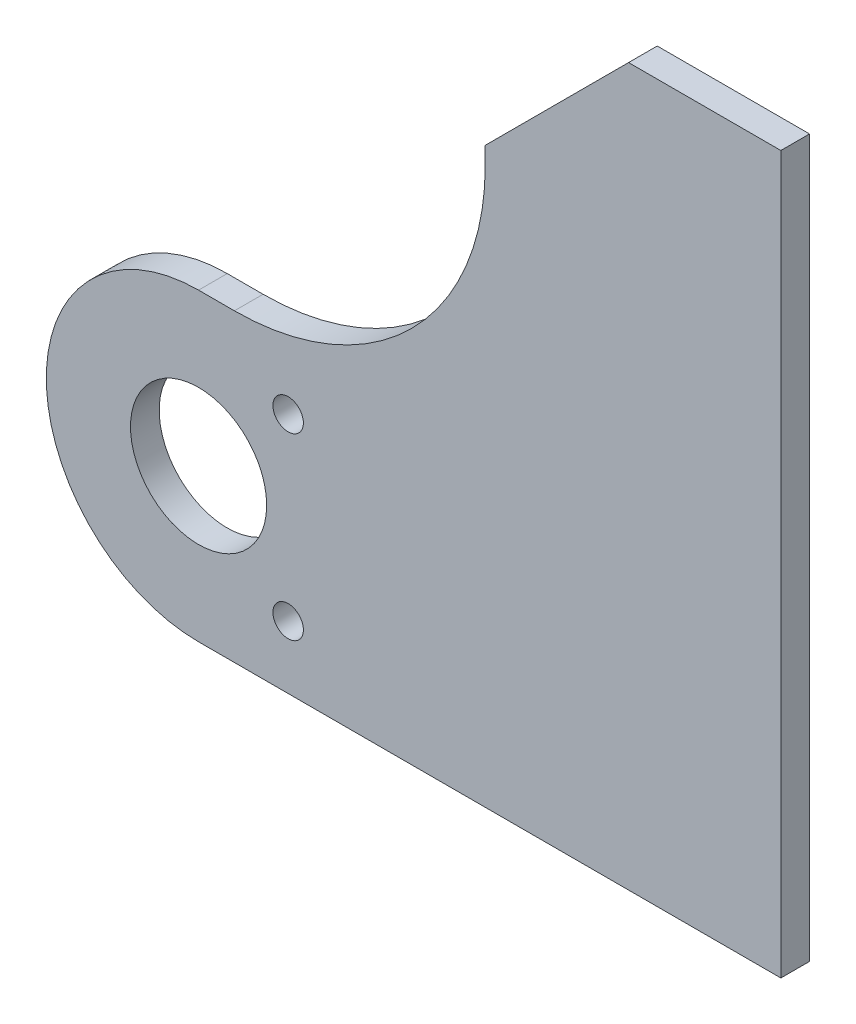
ISO-10303-21;
HEADER;
FILE_DESCRIPTION(('STEP AP214'),'2;1');
FILE_NAME('part.step','',(''),(''),'','','');
FILE_SCHEMA(('AUTOMOTIVE_DESIGN { 1 0 10303 214 1 1 1 1 }'));
ENDSEC;
DATA;
#1=APPLICATION_CONTEXT('core data for automotive mechanical design processes');
#2=APPLICATION_PROTOCOL_DEFINITION('international standard','automotive_design',2000,#1);
#3=PRODUCT_CONTEXT('',#1,'mechanical');
#4=PRODUCT('Part','Part','',(#3));
#5=PRODUCT_RELATED_PRODUCT_CATEGORY('part','',(#4));
#6=PRODUCT_DEFINITION_FORMATION('','',#4);
#7=PRODUCT_DEFINITION_CONTEXT('part definition',#1,'design');
#8=PRODUCT_DEFINITION('design','',#6,#7);
#9=PRODUCT_DEFINITION_SHAPE('','',#8);
#10=(LENGTH_UNIT() NAMED_UNIT(*) SI_UNIT(.MILLI.,.METRE.));
#11=(NAMED_UNIT(*) PLANE_ANGLE_UNIT() SI_UNIT($,.RADIAN.));
#12=(NAMED_UNIT(*) SI_UNIT($,.STERADIAN.) SOLID_ANGLE_UNIT());
#13=UNCERTAINTY_MEASURE_WITH_UNIT(LENGTH_MEASURE(1.E-05),#10,'distance_accuracy_value','');
#14=(GEOMETRIC_REPRESENTATION_CONTEXT(3) GLOBAL_UNCERTAINTY_ASSIGNED_CONTEXT((#13)) GLOBAL_UNIT_ASSIGNED_CONTEXT((#10,
#11,#12)) REPRESENTATION_CONTEXT('',''));
#15=CARTESIAN_POINT('',(0.,0.,0.));
#16=DIRECTION('',(0.,0.,1.));
#17=DIRECTION('',(1.,0.,0.));
#18=AXIS2_PLACEMENT_3D('',#15,#16,#17);
#19=CARTESIAN_POINT('',(0.,0.,4.));
#20=DIRECTION('',(0.,0.,1.));
#21=DIRECTION('',(1.,0.,0.));
#22=AXIS2_PLACEMENT_3D('',#19,#20,#21);
#23=PLANE('',#22);
#24=CARTESIAN_POINT('',(25.,-25.,4.));
#25=DIRECTION('',(0.,0.,1.));
#26=DIRECTION('',(1.,0.,0.));
#27=AXIS2_PLACEMENT_3D('',#24,#25,#26);
#28=CIRCLE('',#27,4.24999999999999);
#29=CARTESIAN_POINT('',(29.25,-25.,4.));
#30=VERTEX_POINT('',#29);
#31=EDGE_CURVE('E242',#30,#30,#28,.T.);
#32=ORIENTED_EDGE('',*,*,#31,.F.);
#33=EDGE_LOOP('',(#32));
#34=FACE_BOUND('',#33,.T.);
#35=CARTESIAN_POINT('',(25.,25.,4.));
#36=DIRECTION('',(0.,0.,1.));
#37=DIRECTION('',(1.,0.,0.));
#38=AXIS2_PLACEMENT_3D('',#35,#36,#37);
#39=CIRCLE('',#38,4.24999999999999);
#40=CARTESIAN_POINT('',(29.25,25.,4.));
#41=VERTEX_POINT('',#40);
#42=EDGE_CURVE('E234',#41,#41,#39,.T.);
#43=ORIENTED_EDGE('',*,*,#42,.F.);
#44=EDGE_LOOP('',(#43));
#45=FACE_BOUND('',#44,.T.);
#46=DIRECTION('',(-0.707106781186547,-0.707106781186548,0.));
#47=VECTOR('',#46,1.);
#48=CARTESIAN_POINT('',(80.,117.5,4.));
#49=LINE('',#48,#47);
#50=CARTESIAN_POINT('',(120.,157.5,4.));
#51=VERTEX_POINT('',#50);
#52=CARTESIAN_POINT('',(80.,117.5,4.));
#53=VERTEX_POINT('',#52);
#54=EDGE_CURVE('E178',#51,#53,#49,.T.);
#55=ORIENTED_EDGE('',*,*,#54,.T.);
#56=DIRECTION('',(0.,-1.,0.));
#57=VECTOR('',#56,1.);
#58=CARTESIAN_POINT('',(80.,112.5,4.));
#59=LINE('',#58,#57);
#60=CARTESIAN_POINT('',(80.,112.5,4.));
#61=VERTEX_POINT('',#60);
#62=EDGE_CURVE('E114',#53,#61,#59,.T.);
#63=ORIENTED_EDGE('',*,*,#62,.T.);
#64=CARTESIAN_POINT('',(10.,112.5,4.));
#65=DIRECTION('',(0.,0.,-1.));
#66=DIRECTION('',(-1.,0.,0.));
#67=AXIS2_PLACEMENT_3D('',#64,#65,#66);
#68=CIRCLE('',#67,70.);
#69=CARTESIAN_POINT('',(10.,42.5,4.));
#70=VERTEX_POINT('',#69);
#71=EDGE_CURVE('E199',#61,#70,#68,.T.);
#72=ORIENTED_EDGE('',*,*,#71,.T.);
#73=DIRECTION('',(-1.,0.,0.));
#74=VECTOR('',#73,1.);
#75=CARTESIAN_POINT('',(0.,42.5,4.));
#76=LINE('',#75,#74);
#77=CARTESIAN_POINT('',(0.,42.5,4.));
#78=VERTEX_POINT('',#77);
#79=EDGE_CURVE('E213',#70,#78,#76,.T.);
#80=ORIENTED_EDGE('',*,*,#79,.T.);
#81=CARTESIAN_POINT('',(0.,0.,4.));
#82=DIRECTION('',(0.,0.,1.));
#83=DIRECTION('',(1.,0.,0.));
#84=AXIS2_PLACEMENT_3D('',#81,#82,#83);
#85=CIRCLE('',#84,42.5);
#86=CARTESIAN_POINT('',(0.,-42.5,4.));
#87=VERTEX_POINT('',#86);
#88=EDGE_CURVE('E133',#78,#87,#85,.T.);
#89=ORIENTED_EDGE('',*,*,#88,.T.);
#90=DIRECTION('',(1.,0.,0.));
#91=VECTOR('',#90,1.);
#92=CARTESIAN_POINT('',(162.5,-42.5,4.));
#93=LINE('',#92,#91);
#94=CARTESIAN_POINT('',(162.5,-42.5,4.));
#95=VERTEX_POINT('',#94);
#96=EDGE_CURVE('E127',#87,#95,#93,.T.);
#97=ORIENTED_EDGE('',*,*,#96,.T.);
#98=DIRECTION('',(0.,1.,0.));
#99=VECTOR('',#98,1.);
#100=CARTESIAN_POINT('',(162.5,157.5,4.));
#101=LINE('',#100,#99);
#102=CARTESIAN_POINT('',(162.5,157.5,4.));
#103=VERTEX_POINT('',#102);
#104=EDGE_CURVE('E131',#95,#103,#101,.T.);
#105=ORIENTED_EDGE('',*,*,#104,.T.);
#106=DIRECTION('',(-1.,0.,0.));
#107=VECTOR('',#106,1.);
#108=CARTESIAN_POINT('',(120.,157.5,4.));
#109=LINE('',#108,#107);
#110=EDGE_CURVE('E71',#103,#51,#109,.T.);
#111=ORIENTED_EDGE('',*,*,#110,.T.);
#112=EDGE_LOOP('',(#55,#63,#72,#80,#89,#97,#105,#111));
#113=FACE_BOUND('',#112,.T.);
#114=CARTESIAN_POINT('',(0.,0.,4.));
#115=DIRECTION('',(0.,0.,1.));
#116=DIRECTION('',(1.,0.,0.));
#117=AXIS2_PLACEMENT_3D('',#114,#115,#116);
#118=CIRCLE('',#117,19.);
#119=CARTESIAN_POINT('',(19.,0.,4.));
#120=VERTEX_POINT('',#119);
#121=EDGE_CURVE('E160',#120,#120,#118,.T.);
#122=ORIENTED_EDGE('',*,*,#121,.F.);
#123=EDGE_LOOP('',(#122));
#124=FACE_BOUND('',#123,.T.);
#125=ADVANCED_FACE('F53',(#34,#45,#113,#124),#23,.T.);
#126=CARTESIAN_POINT('',(0.,0.,-4.));
#127=DIRECTION('',(0.,0.,1.));
#128=DIRECTION('',(1.,0.,0.));
#129=AXIS2_PLACEMENT_3D('',#126,#127,#128);
#130=PLANE('',#129);
#131=CARTESIAN_POINT('',(25.,-25.,-4.));
#132=DIRECTION('',(0.,0.,1.));
#133=DIRECTION('',(1.,0.,0.));
#134=AXIS2_PLACEMENT_3D('',#131,#132,#133);
#135=CIRCLE('',#134,4.25);
#136=CARTESIAN_POINT('',(29.25,-25.,-4.));
#137=VERTEX_POINT('',#136);
#138=EDGE_CURVE('E238',#137,#137,#135,.T.);
#139=ORIENTED_EDGE('',*,*,#138,.T.);
#140=EDGE_LOOP('',(#139));
#141=FACE_BOUND('',#140,.T.);
#142=CARTESIAN_POINT('',(25.,25.,-4.));
#143=DIRECTION('',(0.,0.,1.));
#144=DIRECTION('',(1.,0.,0.));
#145=AXIS2_PLACEMENT_3D('',#142,#143,#144);
#146=CIRCLE('',#145,4.25);
#147=CARTESIAN_POINT('',(29.25,25.,-4.));
#148=VERTEX_POINT('',#147);
#149=EDGE_CURVE('E227',#148,#148,#146,.T.);
#150=ORIENTED_EDGE('',*,*,#149,.T.);
#151=EDGE_LOOP('',(#150));
#152=FACE_BOUND('',#151,.T.);
#153=DIRECTION('',(-0.707106781186547,-0.707106781186548,0.));
#154=VECTOR('',#153,1.);
#155=CARTESIAN_POINT('',(80.,117.5,-4.));
#156=LINE('',#155,#154);
#157=CARTESIAN_POINT('',(120.,157.5,-4.));
#158=VERTEX_POINT('',#157);
#159=CARTESIAN_POINT('',(80.,117.5,-4.));
#160=VERTEX_POINT('',#159);
#161=EDGE_CURVE('E155',#158,#160,#156,.T.);
#162=ORIENTED_EDGE('',*,*,#161,.F.);
#163=DIRECTION('',(-1.,0.,0.));
#164=VECTOR('',#163,1.);
#165=CARTESIAN_POINT('',(120.,157.5,-4.));
#166=LINE('',#165,#164);
#167=CARTESIAN_POINT('',(162.5,157.5,-4.));
#168=VERTEX_POINT('',#167);
#169=EDGE_CURVE('E106',#168,#158,#166,.T.);
#170=ORIENTED_EDGE('',*,*,#169,.F.);
#171=DIRECTION('',(0.,1.,0.));
#172=VECTOR('',#171,1.);
#173=CARTESIAN_POINT('',(162.5,157.5,-4.));
#174=LINE('',#173,#172);
#175=CARTESIAN_POINT('',(162.5,-42.5,-4.));
#176=VERTEX_POINT('',#175);
#177=EDGE_CURVE('E100',#176,#168,#174,.T.);
#178=ORIENTED_EDGE('',*,*,#177,.F.);
#179=DIRECTION('',(1.,0.,0.));
#180=VECTOR('',#179,1.);
#181=CARTESIAN_POINT('',(162.5,-42.5,-4.));
#182=LINE('',#181,#180);
#183=CARTESIAN_POINT('',(0.,-42.5,-4.));
#184=VERTEX_POINT('',#183);
#185=EDGE_CURVE('E142',#184,#176,#182,.T.);
#186=ORIENTED_EDGE('',*,*,#185,.F.);
#187=CARTESIAN_POINT('',(0.,0.,-4.));
#188=DIRECTION('',(0.,0.,1.));
#189=DIRECTION('',(1.,0.,0.));
#190=AXIS2_PLACEMENT_3D('',#187,#188,#189);
#191=CIRCLE('',#190,42.5);
#192=CARTESIAN_POINT('',(0.,42.5,-4.));
#193=VERTEX_POINT('',#192);
#194=EDGE_CURVE('E169',#193,#184,#191,.T.);
#195=ORIENTED_EDGE('',*,*,#194,.F.);
#196=DIRECTION('',(-1.,0.,0.));
#197=VECTOR('',#196,1.);
#198=CARTESIAN_POINT('',(0.,42.5,-4.));
#199=LINE('',#198,#197);
#200=CARTESIAN_POINT('',(10.,42.5,-4.));
#201=VERTEX_POINT('',#200);
#202=EDGE_CURVE('E166',#201,#193,#199,.T.);
#203=ORIENTED_EDGE('',*,*,#202,.F.);
#204=CARTESIAN_POINT('',(10.,112.5,-4.));
#205=DIRECTION('',(0.,0.,-1.));
#206=DIRECTION('',(-1.,0.,0.));
#207=AXIS2_PLACEMENT_3D('',#204,#205,#206);
#208=CIRCLE('',#207,70.);
#209=CARTESIAN_POINT('',(80.,112.5,-4.));
#210=VERTEX_POINT('',#209);
#211=EDGE_CURVE('E163',#210,#201,#208,.T.);
#212=ORIENTED_EDGE('',*,*,#211,.F.);
#213=DIRECTION('',(0.,-1.,0.));
#214=VECTOR('',#213,1.);
#215=CARTESIAN_POINT('',(80.,112.5,-4.));
#216=LINE('',#215,#214);
#217=EDGE_CURVE('E159',#160,#210,#216,.T.);
#218=ORIENTED_EDGE('',*,*,#217,.F.);
#219=EDGE_LOOP('',(#162,#170,#178,#186,#195,#203,#212,#218));
#220=FACE_BOUND('',#219,.T.);
#221=CARTESIAN_POINT('',(0.,0.,-4.));
#222=DIRECTION('',(0.,0.,1.));
#223=DIRECTION('',(1.,0.,0.));
#224=AXIS2_PLACEMENT_3D('',#221,#222,#223);
#225=CIRCLE('',#224,19.);
#226=CARTESIAN_POINT('',(19.,0.,-4.));
#227=VERTEX_POINT('',#226);
#228=EDGE_CURVE('E223',#227,#227,#225,.T.);
#229=ORIENTED_EDGE('',*,*,#228,.T.);
#230=EDGE_LOOP('',(#229));
#231=FACE_BOUND('',#230,.T.);
#232=ADVANCED_FACE('F203',(#141,#152,#220,#231),#130,.F.);
#233=CARTESIAN_POINT('',(80.,117.5,4.));
#234=DIRECTION('',(0.707106781186548,-0.707106781186547,0.));
#235=DIRECTION('',(0.707106781186547,0.707106781186548,0.));
#236=AXIS2_PLACEMENT_3D('',#233,#234,#235);
#237=PLANE('',#236);
#238=ORIENTED_EDGE('',*,*,#161,.T.);
#239=DIRECTION('',(0.,0.,-1.));
#240=VECTOR('',#239,1.);
#241=CARTESIAN_POINT('',(80.,117.5,4.));
#242=LINE('',#241,#240);
#243=EDGE_CURVE('E11',#53,#160,#242,.T.);
#244=ORIENTED_EDGE('',*,*,#243,.F.);
#245=ORIENTED_EDGE('',*,*,#54,.F.);
#246=DIRECTION('',(0.,0.,-1.));
#247=VECTOR('',#246,1.);
#248=CARTESIAN_POINT('',(120.,157.5,4.));
#249=LINE('',#248,#247);
#250=EDGE_CURVE('E151',#51,#158,#249,.T.);
#251=ORIENTED_EDGE('',*,*,#250,.T.);
#252=EDGE_LOOP('',(#238,#244,#245,#251));
#253=FACE_BOUND('',#252,.T.);
#254=ADVANCED_FACE('F55',(#253),#237,.F.);
#255=CARTESIAN_POINT('',(80.,112.5,4.));
#256=DIRECTION('',(1.,0.,0.));
#257=DIRECTION('',(0.,1.,0.));
#258=AXIS2_PLACEMENT_3D('',#255,#256,#257);
#259=PLANE('',#258);
#260=ORIENTED_EDGE('',*,*,#217,.T.);
#261=DIRECTION('',(0.,0.,-1.));
#262=VECTOR('',#261,1.);
#263=CARTESIAN_POINT('',(80.,112.5,4.));
#264=LINE('',#263,#262);
#265=EDGE_CURVE('E63',#61,#210,#264,.T.);
#266=ORIENTED_EDGE('',*,*,#265,.F.);
#267=ORIENTED_EDGE('',*,*,#62,.F.);
#268=ORIENTED_EDGE('',*,*,#243,.T.);
#269=EDGE_LOOP('',(#260,#266,#267,#268));
#270=FACE_BOUND('',#269,.T.);
#271=ADVANCED_FACE('F284',(#270),#259,.F.);
#272=CARTESIAN_POINT('',(10.,112.5,4.));
#273=DIRECTION('',(0.,0.,-1.));
#274=DIRECTION('',(-1.,0.,0.));
#275=AXIS2_PLACEMENT_3D('',#272,#273,#274);
#276=CYLINDRICAL_SURFACE('',#275,70.);
#277=ORIENTED_EDGE('',*,*,#211,.T.);
#278=DIRECTION('',(0.,0.,-1.));
#279=VECTOR('',#278,1.);
#280=CARTESIAN_POINT('',(10.,42.5,4.));
#281=LINE('',#280,#279);
#282=EDGE_CURVE('E189',#70,#201,#281,.T.);
#283=ORIENTED_EDGE('',*,*,#282,.F.);
#284=ORIENTED_EDGE('',*,*,#71,.F.);
#285=ORIENTED_EDGE('',*,*,#265,.T.);
#286=EDGE_LOOP('',(#277,#283,#284,#285));
#287=FACE_BOUND('',#286,.T.);
#288=ADVANCED_FACE('F197',(#287),#276,.F.);
#289=CARTESIAN_POINT('',(0.,42.5,4.));
#290=DIRECTION('',(0.,-1.,0.));
#291=DIRECTION('',(0.,0.,-1.));
#292=AXIS2_PLACEMENT_3D('',#289,#290,#291);
#293=PLANE('',#292);
#294=ORIENTED_EDGE('',*,*,#202,.T.);
#295=DIRECTION('',(0.,0.,-1.));
#296=VECTOR('',#295,1.);
#297=CARTESIAN_POINT('',(0.,42.5,4.));
#298=LINE('',#297,#296);
#299=EDGE_CURVE('E185',#78,#193,#298,.T.);
#300=ORIENTED_EDGE('',*,*,#299,.F.);
#301=ORIENTED_EDGE('',*,*,#79,.F.);
#302=ORIENTED_EDGE('',*,*,#282,.T.);
#303=EDGE_LOOP('',(#294,#300,#301,#302));
#304=FACE_BOUND('',#303,.T.);
#305=ADVANCED_FACE('F208',(#304),#293,.F.);
#306=CARTESIAN_POINT('',(0.,0.,4.));
#307=DIRECTION('',(0.,0.,-1.));
#308=DIRECTION('',(-1.,0.,0.));
#309=AXIS2_PLACEMENT_3D('',#306,#307,#308);
#310=CYLINDRICAL_SURFACE('',#309,42.5);
#311=ORIENTED_EDGE('',*,*,#194,.T.);
#312=DIRECTION('',(0.,0.,-1.));
#313=VECTOR('',#312,1.);
#314=CARTESIAN_POINT('',(0.,-42.5,4.));
#315=LINE('',#314,#313);
#316=EDGE_CURVE('E144',#87,#184,#315,.T.);
#317=ORIENTED_EDGE('',*,*,#316,.F.);
#318=ORIENTED_EDGE('',*,*,#88,.F.);
#319=ORIENTED_EDGE('',*,*,#299,.T.);
#320=EDGE_LOOP('',(#311,#317,#318,#319));
#321=FACE_BOUND('',#320,.T.);
#322=ADVANCED_FACE('F211',(#321),#310,.T.);
#323=CARTESIAN_POINT('',(162.5,-42.5,4.));
#324=DIRECTION('',(0.,1.,0.));
#325=DIRECTION('',(0.,0.,1.));
#326=AXIS2_PLACEMENT_3D('',#323,#324,#325);
#327=PLANE('',#326);
#328=ORIENTED_EDGE('',*,*,#185,.T.);
#329=DIRECTION('',(0.,0.,-1.));
#330=VECTOR('',#329,1.);
#331=CARTESIAN_POINT('',(162.5,-42.5,4.));
#332=LINE('',#331,#330);
#333=EDGE_CURVE('E139',#95,#176,#332,.T.);
#334=ORIENTED_EDGE('',*,*,#333,.F.);
#335=ORIENTED_EDGE('',*,*,#96,.F.);
#336=ORIENTED_EDGE('',*,*,#316,.T.);
#337=EDGE_LOOP('',(#328,#334,#335,#336));
#338=FACE_BOUND('',#337,.T.);
#339=ADVANCED_FACE('F140',(#338),#327,.F.);
#340=CARTESIAN_POINT('',(162.5,157.5,4.));
#341=DIRECTION('',(-1.,0.,0.));
#342=DIRECTION('',(0.,-1.,0.));
#343=AXIS2_PLACEMENT_3D('',#340,#341,#342);
#344=PLANE('',#343);
#345=ORIENTED_EDGE('',*,*,#177,.T.);
#346=DIRECTION('',(0.,0.,-1.));
#347=VECTOR('',#346,1.);
#348=CARTESIAN_POINT('',(162.5,157.5,4.));
#349=LINE('',#348,#347);
#350=EDGE_CURVE('E145',#103,#168,#349,.T.);
#351=ORIENTED_EDGE('',*,*,#350,.F.);
#352=ORIENTED_EDGE('',*,*,#104,.F.);
#353=ORIENTED_EDGE('',*,*,#333,.T.);
#354=EDGE_LOOP('',(#345,#351,#352,#353));
#355=FACE_BOUND('',#354,.T.);
#356=ADVANCED_FACE('F147',(#355),#344,.F.);
#357=CARTESIAN_POINT('',(120.,157.5,4.));
#358=DIRECTION('',(0.,-1.,0.));
#359=DIRECTION('',(0.,0.,-1.));
#360=AXIS2_PLACEMENT_3D('',#357,#358,#359);
#361=PLANE('',#360);
#362=ORIENTED_EDGE('',*,*,#169,.T.);
#363=ORIENTED_EDGE('',*,*,#250,.F.);
#364=ORIENTED_EDGE('',*,*,#110,.F.);
#365=ORIENTED_EDGE('',*,*,#350,.T.);
#366=EDGE_LOOP('',(#362,#363,#364,#365));
#367=FACE_BOUND('',#366,.T.);
#368=ADVANCED_FACE('F265',(#367),#361,.F.);
#369=CARTESIAN_POINT('',(0.,0.,4.));
#370=DIRECTION('',(0.,0.,-1.));
#371=DIRECTION('',(-1.,0.,0.));
#372=AXIS2_PLACEMENT_3D('',#369,#370,#371);
#373=CYLINDRICAL_SURFACE('',#372,19.);
#374=ORIENTED_EDGE('',*,*,#121,.T.);
#375=EDGE_LOOP('',(#374));
#376=FACE_BOUND('',#375,.T.);
#377=ORIENTED_EDGE('',*,*,#228,.F.);
#378=EDGE_LOOP('',(#377));
#379=FACE_BOUND('',#378,.T.);
#380=ADVANCED_FACE('F256',(#376,#379),#373,.F.);
#381=CARTESIAN_POINT('',(25.,25.,4.));
#382=DIRECTION('',(0.,0.,1.));
#383=DIRECTION('',(1.,0.,0.));
#384=AXIS2_PLACEMENT_3D('',#381,#382,#383);
#385=CYLINDRICAL_SURFACE('',#384,4.24999999999999);
#386=ORIENTED_EDGE('',*,*,#149,.F.);
#387=EDGE_LOOP('',(#386));
#388=FACE_BOUND('',#387,.T.);
#389=ORIENTED_EDGE('',*,*,#42,.T.);
#390=EDGE_LOOP('',(#389));
#391=FACE_BOUND('',#390,.T.);
#392=ADVANCED_FACE('F254',(#388,#391),#385,.F.);
#393=CARTESIAN_POINT('',(25.,-25.,4.));
#394=DIRECTION('',(0.,0.,1.));
#395=DIRECTION('',(1.,0.,0.));
#396=AXIS2_PLACEMENT_3D('',#393,#394,#395);
#397=CYLINDRICAL_SURFACE('',#396,4.24999999999999);
#398=ORIENTED_EDGE('',*,*,#138,.F.);
#399=EDGE_LOOP('',(#398));
#400=FACE_BOUND('',#399,.T.);
#401=ORIENTED_EDGE('',*,*,#31,.T.);
#402=EDGE_LOOP('',(#401));
#403=FACE_BOUND('',#402,.T.);
#404=ADVANCED_FACE('F247',(#400,#403),#397,.F.);
#405=CLOSED_SHELL('',(#125,#232,#254,#271,#288,#305,#322,#339,#356,#368,#380,#392,#404));
#406=MANIFOLD_SOLID_BREP('B2',#405);
#407=ADVANCED_BREP_SHAPE_REPRESENTATION('',(#18,#406),#14);
#408=SHAPE_DEFINITION_REPRESENTATION(#9,#407);
ENDSEC;
END-ISO-10303-21;
